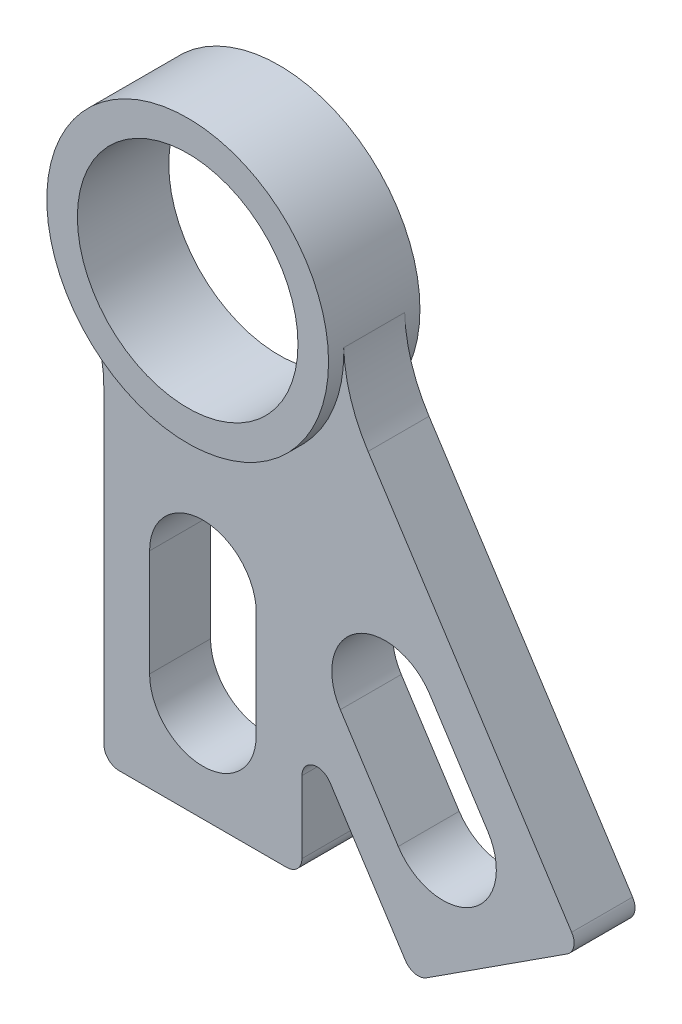
ISO-10303-21;
HEADER;
FILE_DESCRIPTION(('STEP AP214'),'2;1');
FILE_NAME('part.step','',(''),(''),'','','');
FILE_SCHEMA(('AUTOMOTIVE_DESIGN { 1 0 10303 214 1 1 1 1 }'));
ENDSEC;
DATA;
#1=APPLICATION_CONTEXT('core data for automotive mechanical design processes');
#2=APPLICATION_PROTOCOL_DEFINITION('international standard','automotive_design',2000,#1);
#3=PRODUCT_CONTEXT('',#1,'mechanical');
#4=PRODUCT('Part','Part','',(#3));
#5=PRODUCT_RELATED_PRODUCT_CATEGORY('part','',(#4));
#6=PRODUCT_DEFINITION_FORMATION('','',#4);
#7=PRODUCT_DEFINITION_CONTEXT('part definition',#1,'design');
#8=PRODUCT_DEFINITION('design','',#6,#7);
#9=PRODUCT_DEFINITION_SHAPE('','',#8);
#10=(LENGTH_UNIT() NAMED_UNIT(*) SI_UNIT(.MILLI.,.METRE.));
#11=(NAMED_UNIT(*) PLANE_ANGLE_UNIT() SI_UNIT($,.RADIAN.));
#12=(NAMED_UNIT(*) SI_UNIT($,.STERADIAN.) SOLID_ANGLE_UNIT());
#13=UNCERTAINTY_MEASURE_WITH_UNIT(LENGTH_MEASURE(1.E-05),#10,'distance_accuracy_value','');
#14=(GEOMETRIC_REPRESENTATION_CONTEXT(3) GLOBAL_UNCERTAINTY_ASSIGNED_CONTEXT((#13)) GLOBAL_UNIT_ASSIGNED_CONTEXT((#10,
#11,#12)) REPRESENTATION_CONTEXT('',''));
#15=CARTESIAN_POINT('',(0.,0.,0.));
#16=DIRECTION('',(0.,0.,1.));
#17=DIRECTION('',(1.,0.,0.));
#18=AXIS2_PLACEMENT_3D('',#15,#16,#17);
#19=CARTESIAN_POINT('',(0.,0.,4.7625));
#20=DIRECTION('',(0.,0.,-1.));
#21=DIRECTION('',(-1.,0.,0.));
#22=AXIS2_PLACEMENT_3D('',#19,#20,#21);
#23=CYLINDRICAL_SURFACE('',#22,11.495405);
#24=CARTESIAN_POINT('',(0.,0.,4.7625));
#25=DIRECTION('',(0.,0.,1.));
#26=DIRECTION('',(1.,0.,0.));
#27=AXIS2_PLACEMENT_3D('',#24,#25,#26);
#28=CIRCLE('',#27,11.495405);
#29=CARTESIAN_POINT('',(-11.495405,0.,4.7625));
#30=VERTEX_POINT('',#29);
#31=EDGE_CURVE('E380',#30,#30,#28,.T.);
#32=CARTESIAN_POINT('',(0.,0.,-4.7625));
#33=DIRECTION('',(0.,0.,1.));
#34=DIRECTION('',(1.,0.,0.));
#35=AXIS2_PLACEMENT_3D('',#32,#33,#34);
#36=CIRCLE('',#35,11.495405);
#37=CARTESIAN_POINT('',(-11.495405,0.,-4.7625));
#38=VERTEX_POINT('',#37);
#39=EDGE_CURVE('E732',#38,#38,#36,.T.);
#40=CARTESIAN_POINT('',(-11.495405,0.,4.7625));
#41=CARTESIAN_POINT('',(-11.495405,0.,4.66328125));
#42=CARTESIAN_POINT('',(-11.495405,0.,4.5640625));
#43=CARTESIAN_POINT('',(-11.495405,0.,4.365625));
#44=CARTESIAN_POINT('',(-11.495405,0.,4.26640625));
#45=CARTESIAN_POINT('',(-11.495405,0.,4.06796875));
#46=CARTESIAN_POINT('',(-11.495405,0.,3.96875));
#47=CARTESIAN_POINT('',(-11.495405,0.,3.7703125));
#48=CARTESIAN_POINT('',(-11.495405,0.,3.67109375));
#49=CARTESIAN_POINT('',(-11.495405,0.,3.47265625));
#50=CARTESIAN_POINT('',(-11.495405,0.,3.3734375));
#51=CARTESIAN_POINT('',(-11.495405,0.,3.175));
#52=CARTESIAN_POINT('',(-11.495405,0.,3.07578125));
#53=CARTESIAN_POINT('',(-11.495405,0.,2.87734375));
#54=CARTESIAN_POINT('',(-11.495405,0.,2.778125));
#55=CARTESIAN_POINT('',(-11.495405,0.,2.5796875));
#56=CARTESIAN_POINT('',(-11.495405,0.,2.48046875));
#57=CARTESIAN_POINT('',(-11.495405,0.,2.28203125));
#58=CARTESIAN_POINT('',(-11.495405,0.,2.1828125));
#59=CARTESIAN_POINT('',(-11.495405,0.,1.984375));
#60=CARTESIAN_POINT('',(-11.495405,0.,1.88515625));
#61=CARTESIAN_POINT('',(-11.495405,0.,1.68671875));
#62=CARTESIAN_POINT('',(-11.495405,0.,1.5875));
#63=CARTESIAN_POINT('',(-11.495405,0.,1.3890625));
#64=CARTESIAN_POINT('',(-11.495405,0.,1.28984375));
#65=CARTESIAN_POINT('',(-11.495405,0.,1.09140625));
#66=CARTESIAN_POINT('',(-11.495405,0.,0.992187499999999));
#67=CARTESIAN_POINT('',(-11.495405,0.,0.79375));
#68=CARTESIAN_POINT('',(-11.495405,0.,0.69453125));
#69=CARTESIAN_POINT('',(-11.495405,0.,0.49609375));
#70=CARTESIAN_POINT('',(-11.495405,0.,0.396875));
#71=CARTESIAN_POINT('',(-11.495405,0.,0.1984375));
#72=CARTESIAN_POINT('',(-11.495405,0.,0.0992187500000001));
#73=CARTESIAN_POINT('',(-11.495405,0.,-0.0992187500000001));
#74=CARTESIAN_POINT('',(-11.495405,0.,-0.1984375));
#75=CARTESIAN_POINT('',(-11.495405,0.,-0.396875));
#76=CARTESIAN_POINT('',(-11.495405,0.,-0.49609375));
#77=CARTESIAN_POINT('',(-11.495405,0.,-0.69453125));
#78=CARTESIAN_POINT('',(-11.495405,0.,-0.793750000000001));
#79=CARTESIAN_POINT('',(-11.495405,0.,-0.992187500000001));
#80=CARTESIAN_POINT('',(-11.495405,0.,-1.09140625));
#81=CARTESIAN_POINT('',(-11.495405,0.,-1.28984375));
#82=CARTESIAN_POINT('',(-11.495405,0.,-1.3890625));
#83=CARTESIAN_POINT('',(-11.495405,0.,-1.5875));
#84=CARTESIAN_POINT('',(-11.495405,0.,-1.68671875));
#85=CARTESIAN_POINT('',(-11.495405,0.,-1.88515625));
#86=CARTESIAN_POINT('',(-11.495405,0.,-1.984375));
#87=CARTESIAN_POINT('',(-11.495405,0.,-2.1828125));
#88=CARTESIAN_POINT('',(-11.495405,0.,-2.28203125));
#89=CARTESIAN_POINT('',(-11.495405,0.,-2.48046875));
#90=CARTESIAN_POINT('',(-11.495405,0.,-2.5796875));
#91=CARTESIAN_POINT('',(-11.495405,0.,-2.778125));
#92=CARTESIAN_POINT('',(-11.495405,0.,-2.87734375));
#93=CARTESIAN_POINT('',(-11.495405,0.,-3.07578125));
#94=CARTESIAN_POINT('',(-11.495405,0.,-3.175));
#95=CARTESIAN_POINT('',(-11.495405,0.,-3.3734375));
#96=CARTESIAN_POINT('',(-11.495405,0.,-3.47265625));
#97=CARTESIAN_POINT('',(-11.495405,0.,-3.67109375));
#98=CARTESIAN_POINT('',(-11.495405,0.,-3.7703125));
#99=CARTESIAN_POINT('',(-11.495405,0.,-3.96875));
#100=CARTESIAN_POINT('',(-11.495405,0.,-4.06796875));
#101=CARTESIAN_POINT('',(-11.495405,0.,-4.26640625));
#102=CARTESIAN_POINT('',(-11.495405,0.,-4.365625));
#103=CARTESIAN_POINT('',(-11.495405,0.,-4.5640625));
#104=CARTESIAN_POINT('',(-11.495405,0.,-4.66328125));
#105=CARTESIAN_POINT('',(-11.495405,0.,-4.7625));
#106=B_SPLINE_CURVE_WITH_KNOTS('',3,(#40,#41,#42,#43,#44,#45,#46,#47,#48,#49,#50,#51,#52,#53,
#54,#55,#56,#57,#58,#59,#60,#61,#62,#63,#64,#65,#66,#67,#68,#69,#70,#71,#72,#73,#74,#75,#76,#77,
#78,#79,#80,#81,#82,#83,#84,#85,#86,#87,#88,#89,#90,#91,#92,#93,#94,#95,#96,#97,#98,#99,#100,
#101,#102,#103,#104,#105),.UNSPECIFIED.,.F.,.F.,(4,2,2,2,2,2,2,2,2,2,2,2,2,2,2,2,2,2,2,2,2,2,2,
2,2,2,2,2,2,2,2,2,4),(0.,0.29765625,0.5953125,0.892968750000001,1.190625,1.48828125,1.7859375,
2.08359375,2.38125,2.67890625,2.9765625,3.27421875,3.571875,3.86953125,4.1671875,4.46484375,
4.7625,5.06015625,5.3578125,5.65546875,5.953125,6.25078125,6.5484375,6.84609375,7.14375,
7.44140625,7.7390625,8.03671875,8.334375,8.63203125,8.9296875,9.22734375,9.525),.UNSPECIFIED.);
#107=EDGE_CURVE('BSEAM39',#30,#38,#106,.T.);
#108=ORIENTED_EDGE('',*,*,#31,.T.);
#109=ORIENTED_EDGE('',*,*,#39,.F.);
#110=ORIENTED_EDGE('',*,*,#107,.T.);
#111=ORIENTED_EDGE('',*,*,#107,.F.);
#112=EDGE_LOOP('',(#108,#110,#109,#111));
#113=FACE_BOUND('',#112,.T.);
#114=ADVANCED_FACE('F39',(#113),#23,.F.);
#115=CARTESIAN_POINT('',(0.,0.,4.7625));
#116=DIRECTION('',(0.,0.,-1.));
#117=DIRECTION('',(-1.,0.,0.));
#118=AXIS2_PLACEMENT_3D('',#115,#116,#117);
#119=CYLINDRICAL_SURFACE('',#118,14.6812);
#120=DIRECTION('',(0.,0.,-1.));
#121=VECTOR('',#120,1.);
#122=CARTESIAN_POINT('',(-12.585193266832,-7.55979787272684,3.175));
#123=LINE('',#122,#121);
#124=CARTESIAN_POINT('',(-12.585193266832,-7.55979787272684,3.175));
#125=VERTEX_POINT('',#124);
#126=CARTESIAN_POINT('',(-12.585193266832,-7.55979787272684,-3.175));
#127=VERTEX_POINT('',#126);
#128=EDGE_CURVE('E200',#125,#127,#123,.T.);
#129=ORIENTED_EDGE('',*,*,#128,.F.);
#130=CARTESIAN_POINT('',(0.,0.,3.175));
#131=DIRECTION('',(0.,0.,1.));
#132=DIRECTION('',(1.,0.,0.));
#133=AXIS2_PLACEMENT_3D('',#130,#131,#132);
#134=CIRCLE('',#133,14.6812);
#135=CARTESIAN_POINT('',(14.6729838648991,0.491098707398738,3.175));
#136=VERTEX_POINT('',#135);
#137=EDGE_CURVE('E216',#125,#136,#134,.T.);
#138=ORIENTED_EDGE('',*,*,#137,.T.);
#139=DIRECTION('',(0.,0.,-1.));
#140=VECTOR('',#139,1.);
#141=CARTESIAN_POINT('',(14.6729838648992,0.491098707398739,3.175));
#142=LINE('',#141,#140);
#143=CARTESIAN_POINT('',(14.6729838648992,0.491098707398739,-3.175));
#144=VERTEX_POINT('',#143);
#145=EDGE_CURVE('E299',#136,#144,#142,.T.);
#146=ORIENTED_EDGE('',*,*,#145,.T.);
#147=CARTESIAN_POINT('',(0.,0.,-3.175));
#148=DIRECTION('',(0.,0.,1.));
#149=DIRECTION('',(1.,0.,0.));
#150=AXIS2_PLACEMENT_3D('',#147,#148,#149);
#151=CIRCLE('',#150,14.6812);
#152=EDGE_CURVE('E300',#127,#144,#151,.T.);
#153=ORIENTED_EDGE('',*,*,#152,.F.);
#154=EDGE_LOOP('',(#129,#138,#146,#153));
#155=FACE_BOUND('',#154,.T.);
#156=CARTESIAN_POINT('',(0.,0.,4.7625));
#157=DIRECTION('',(0.,0.,1.));
#158=DIRECTION('',(1.,0.,0.));
#159=AXIS2_PLACEMENT_3D('',#156,#157,#158);
#160=CIRCLE('',#159,14.6812);
#161=CARTESIAN_POINT('',(14.6812,0.,4.7625));
#162=VERTEX_POINT('',#161);
#163=EDGE_CURVE('E437',#162,#162,#160,.T.);
#164=ORIENTED_EDGE('',*,*,#163,.F.);
#165=EDGE_LOOP('',(#164));
#166=FACE_BOUND('',#165,.T.);
#167=CARTESIAN_POINT('',(0.,0.,-4.7625));
#168=DIRECTION('',(0.,0.,1.));
#169=DIRECTION('',(1.,0.,0.));
#170=AXIS2_PLACEMENT_3D('',#167,#168,#169);
#171=CIRCLE('',#170,14.6812);
#172=CARTESIAN_POINT('',(14.6812,0.,-4.7625));
#173=VERTEX_POINT('',#172);
#174=EDGE_CURVE('E442',#173,#173,#171,.T.);
#175=ORIENTED_EDGE('',*,*,#174,.T.);
#176=EDGE_LOOP('',(#175));
#177=FACE_BOUND('',#176,.T.);
#178=ADVANCED_FACE('F470',(#155,#166,#177),#119,.T.);
#179=CARTESIAN_POINT('',(0.,0.,4.7625));
#180=DIRECTION('',(0.,0.,1.));
#181=DIRECTION('',(1.,0.,0.));
#182=AXIS2_PLACEMENT_3D('',#179,#180,#181);
#183=PLANE('',#182);
#184=ORIENTED_EDGE('',*,*,#31,.F.);
#185=EDGE_LOOP('',(#184));
#186=FACE_BOUND('',#185,.T.);
#187=ORIENTED_EDGE('',*,*,#163,.T.);
#188=EDGE_LOOP('',(#187));
#189=FACE_BOUND('',#188,.T.);
#190=ADVANCED_FACE('F497',(#186,#189),#183,.T.);
#191=CARTESIAN_POINT('',(0.,0.,-4.7625));
#192=DIRECTION('',(0.,0.,1.));
#193=DIRECTION('',(1.,0.,0.));
#194=AXIS2_PLACEMENT_3D('',#191,#192,#193);
#195=PLANE('',#194);
#196=ORIENTED_EDGE('',*,*,#39,.T.);
#197=EDGE_LOOP('',(#196));
#198=FACE_BOUND('',#197,.T.);
#199=ORIENTED_EDGE('',*,*,#174,.F.);
#200=EDGE_LOOP('',(#199));
#201=FACE_BOUND('',#200,.T.);
#202=ADVANCED_FACE('F690',(#198,#201),#195,.F.);
#203=CARTESIAN_POINT('',(0.,-27.9580697939255,3.175));
#204=DIRECTION('',(0.,0.,-1.));
#205=DIRECTION('',(-1.,0.,0.));
#206=AXIS2_PLACEMENT_3D('',#203,#204,#205);
#207=CYLINDRICAL_SURFACE('',#206,5.55624999999843);
#208=CARTESIAN_POINT('',(0.,-27.9580697939255,-3.175));
#209=DIRECTION('',(0.,0.,1.));
#210=DIRECTION('',(1.,0.,0.));
#211=AXIS2_PLACEMENT_3D('',#208,#209,#210);
#212=CIRCLE('',#211,5.55624999999843);
#213=CARTESIAN_POINT('',(5.55624999999843,-27.9580697939256,-3.175));
#214=VERTEX_POINT('',#213);
#215=CARTESIAN_POINT('',(-5.55624999999843,-27.9580697939256,-3.175));
#216=VERTEX_POINT('',#215);
#217=EDGE_CURVE('E340',#214,#216,#212,.T.);
#218=ORIENTED_EDGE('',*,*,#217,.F.);
#219=DIRECTION('',(0.,0.,-1.));
#220=VECTOR('',#219,1.);
#221=CARTESIAN_POINT('',(5.55624999999843,-27.9580697939256,3.175));
#222=LINE('',#221,#220);
#223=CARTESIAN_POINT('',(5.55624999999843,-27.9580697939256,3.175));
#224=VERTEX_POINT('',#223);
#225=EDGE_CURVE('E734',#224,#214,#222,.T.);
#226=ORIENTED_EDGE('',*,*,#225,.F.);
#227=CARTESIAN_POINT('',(0.,-27.9580697939255,3.175));
#228=DIRECTION('',(0.,0.,1.));
#229=DIRECTION('',(1.,0.,0.));
#230=AXIS2_PLACEMENT_3D('',#227,#228,#229);
#231=CIRCLE('',#230,5.55624999999843);
#232=CARTESIAN_POINT('',(-5.55624999999843,-27.9580697939256,3.175));
#233=VERTEX_POINT('',#232);
#234=EDGE_CURVE('E280',#224,#233,#231,.T.);
#235=ORIENTED_EDGE('',*,*,#234,.T.);
#236=DIRECTION('',(0.,0.,-1.));
#237=VECTOR('',#236,1.);
#238=CARTESIAN_POINT('',(-5.55624999999843,-27.9580697939256,3.175));
#239=LINE('',#238,#237);
#240=EDGE_CURVE('E359',#233,#216,#239,.T.);
#241=ORIENTED_EDGE('',*,*,#240,.T.);
#242=EDGE_LOOP('',(#218,#226,#235,#241));
#243=FACE_BOUND('',#242,.T.);
#244=ADVANCED_FACE('F680',(#243),#207,.F.);
#245=CARTESIAN_POINT('',(5.55624999999831,0.,3.175));
#246=DIRECTION('',(-1.,0.,0.));
#247=DIRECTION('',(0.,-1.,0.));
#248=AXIS2_PLACEMENT_3D('',#245,#246,#247);
#249=PLANE('',#248);
#250=DIRECTION('',(0.,1.,0.));
#251=VECTOR('',#250,1.);
#252=CARTESIAN_POINT('',(5.55624999999831,0.,-3.175));
#253=LINE('',#252,#251);
#254=CARTESIAN_POINT('',(5.55624999999848,-39.0705697939288,-3.175));
#255=VERTEX_POINT('',#254);
#256=EDGE_CURVE('E346',#255,#214,#253,.T.);
#257=ORIENTED_EDGE('',*,*,#256,.F.);
#258=DIRECTION('',(0.,0.,-1.));
#259=VECTOR('',#258,1.);
#260=CARTESIAN_POINT('',(5.55624999999848,-39.0705697939288,3.175));
#261=LINE('',#260,#259);
#262=CARTESIAN_POINT('',(5.55624999999848,-39.0705697939288,3.175));
#263=VERTEX_POINT('',#262);
#264=EDGE_CURVE('E736',#263,#255,#261,.T.);
#265=ORIENTED_EDGE('',*,*,#264,.F.);
#266=DIRECTION('',(0.,1.,0.));
#267=VECTOR('',#266,1.);
#268=CARTESIAN_POINT('',(5.55624999999831,0.,3.175));
#269=LINE('',#268,#267);
#270=EDGE_CURVE('E284',#263,#224,#269,.T.);
#271=ORIENTED_EDGE('',*,*,#270,.T.);
#272=ORIENTED_EDGE('',*,*,#225,.T.);
#273=EDGE_LOOP('',(#257,#265,#271,#272));
#274=FACE_BOUND('',#273,.T.);
#275=ADVANCED_FACE('F670',(#274),#249,.T.);
#276=CARTESIAN_POINT('',(0.,-39.0705697939288,3.175));
#277=DIRECTION('',(0.,0.,-1.));
#278=DIRECTION('',(-1.,0.,0.));
#279=AXIS2_PLACEMENT_3D('',#276,#277,#278);
#280=CYLINDRICAL_SURFACE('',#279,5.55624999999845);
#281=CARTESIAN_POINT('',(0.,-39.0705697939288,-3.175));
#282=DIRECTION('',(0.,0.,1.));
#283=DIRECTION('',(1.,0.,0.));
#284=AXIS2_PLACEMENT_3D('',#281,#282,#283);
#285=CIRCLE('',#284,5.55624999999845);
#286=CARTESIAN_POINT('',(-5.55624999999842,-39.0705697939288,-3.175));
#287=VERTEX_POINT('',#286);
#288=EDGE_CURVE('E357',#287,#255,#285,.T.);
#289=ORIENTED_EDGE('',*,*,#288,.F.);
#290=DIRECTION('',(0.,0.,-1.));
#291=VECTOR('',#290,1.);
#292=CARTESIAN_POINT('',(-5.55624999999842,-39.0705697939288,3.175));
#293=LINE('',#292,#291);
#294=CARTESIAN_POINT('',(-5.55624999999842,-39.0705697939288,3.175));
#295=VERTEX_POINT('',#294);
#296=EDGE_CURVE('E362',#295,#287,#293,.T.);
#297=ORIENTED_EDGE('',*,*,#296,.F.);
#298=CARTESIAN_POINT('',(0.,-39.0705697939288,3.175));
#299=DIRECTION('',(0.,0.,1.));
#300=DIRECTION('',(1.,0.,0.));
#301=AXIS2_PLACEMENT_3D('',#298,#299,#300);
#302=CIRCLE('',#301,5.55624999999845);
#303=EDGE_CURVE('E288',#295,#263,#302,.T.);
#304=ORIENTED_EDGE('',*,*,#303,.T.);
#305=ORIENTED_EDGE('',*,*,#264,.T.);
#306=EDGE_LOOP('',(#289,#297,#304,#305));
#307=FACE_BOUND('',#306,.T.);
#308=ADVANCED_FACE('F660',(#307),#280,.F.);
#309=CARTESIAN_POINT('',(18.9851807063122,-29.335661577197,3.175));
#310=DIRECTION('',(0.,0.,-1.));
#311=DIRECTION('',(-1.,0.,0.));
#312=AXIS2_PLACEMENT_3D('',#309,#310,#311);
#313=CYLINDRICAL_SURFACE('',#312,5.55624999999836);
#314=CARTESIAN_POINT('',(18.9851807063122,-29.335661577197,-3.175));
#315=DIRECTION('',(0.,0.,1.));
#316=DIRECTION('',(1.,0.,0.));
#317=AXIS2_PLACEMENT_3D('',#314,#315,#316);
#318=CIRCLE('',#317,5.55624999999836);
#319=CARTESIAN_POINT('',(23.649804352704,-26.3168538158441,-3.175));
#320=VERTEX_POINT('',#319);
#321=CARTESIAN_POINT('',(14.3205570599207,-32.3544693385504,-3.175));
#322=VERTEX_POINT('',#321);
#323=EDGE_CURVE('E323',#320,#322,#318,.T.);
#324=ORIENTED_EDGE('',*,*,#323,.F.);
#325=DIRECTION('',(0.,0.,-1.));
#326=VECTOR('',#325,1.);
#327=CARTESIAN_POINT('',(23.649804352704,-26.3168538158441,3.175));
#328=LINE('',#327,#326);
#329=CARTESIAN_POINT('',(23.649804352704,-26.3168538158441,3.175));
#330=VERTEX_POINT('',#329);
#331=EDGE_CURVE('E363',#330,#320,#328,.T.);
#332=ORIENTED_EDGE('',*,*,#331,.F.);
#333=CARTESIAN_POINT('',(18.9851807063122,-29.335661577197,3.175));
#334=DIRECTION('',(0.,0.,1.));
#335=DIRECTION('',(1.,0.,0.));
#336=AXIS2_PLACEMENT_3D('',#333,#334,#335);
#337=CIRCLE('',#336,5.55624999999836);
#338=CARTESIAN_POINT('',(14.3205570599207,-32.3544693385504,3.175));
#339=VERTEX_POINT('',#338);
#340=EDGE_CURVE('E262',#330,#339,#337,.T.);
#341=ORIENTED_EDGE('',*,*,#340,.T.);
#342=DIRECTION('',(0.,0.,-1.));
#343=VECTOR('',#342,1.);
#344=CARTESIAN_POINT('',(14.3205570599207,-32.3544693385504,3.175));
#345=LINE('',#344,#343);
#346=EDGE_CURVE('E379',#339,#322,#345,.T.);
#347=ORIENTED_EDGE('',*,*,#346,.T.);
#348=EDGE_LOOP('',(#324,#332,#341,#347));
#349=FACE_BOUND('',#348,.T.);
#350=ADVANCED_FACE('F650',(#349),#313,.F.);
#351=CARTESIAN_POINT('',(4.6646236463908,3.0188077613531,3.175));
#352=DIRECTION('',(-0.839527315436269,-0.543317482358493,0.));
#353=DIRECTION('',(0.543317482358493,-0.839527315436269,0.));
#354=AXIS2_PLACEMENT_3D('',#351,#352,#353);
#355=PLANE('',#354);
#356=DIRECTION('',(-0.543317482358493,0.839527315436269,0.));
#357=VECTOR('',#356,1.);
#358=CARTESIAN_POINT('',(4.6646236463908,3.0188077613531,-3.175));
#359=LINE('',#358,#357);
#360=CARTESIAN_POINT('',(29.6874198754141,-35.6461011086318,-3.175));
#361=VERTEX_POINT('',#360);
#362=EDGE_CURVE('E327',#361,#320,#359,.T.);
#363=ORIENTED_EDGE('',*,*,#362,.F.);
#364=DIRECTION('',(0.,0.,-1.));
#365=VECTOR('',#364,1.);
#366=CARTESIAN_POINT('',(29.6874198754141,-35.6461011086318,3.175));
#367=LINE('',#366,#365);
#368=CARTESIAN_POINT('',(29.6874198754141,-35.6461011086318,3.175));
#369=VERTEX_POINT('',#368);
#370=EDGE_CURVE('E745',#369,#361,#367,.T.);
#371=ORIENTED_EDGE('',*,*,#370,.F.);
#372=DIRECTION('',(-0.543317482358493,0.839527315436269,0.));
#373=VECTOR('',#372,1.);
#374=CARTESIAN_POINT('',(4.6646236463908,3.0188077613531,3.175));
#375=LINE('',#374,#373);
#376=EDGE_CURVE('E266',#369,#330,#375,.T.);
#377=ORIENTED_EDGE('',*,*,#376,.T.);
#378=ORIENTED_EDGE('',*,*,#331,.T.);
#379=EDGE_LOOP('',(#363,#371,#377,#378));
#380=FACE_BOUND('',#379,.T.);
#381=ADVANCED_FACE('F640',(#380),#355,.T.);
#382=CARTESIAN_POINT('',(25.0227962290226,-38.6649088699853,3.175));
#383=DIRECTION('',(0.,0.,-1.));
#384=DIRECTION('',(-1.,0.,0.));
#385=AXIS2_PLACEMENT_3D('',#382,#383,#384);
#386=CYLINDRICAL_SURFACE('',#385,5.55624999999846);
#387=CARTESIAN_POINT('',(25.0227962290226,-38.6649088699853,-3.175));
#388=DIRECTION('',(0.,0.,1.));
#389=DIRECTION('',(1.,0.,0.));
#390=AXIS2_PLACEMENT_3D('',#387,#388,#389);
#391=CIRCLE('',#390,5.55624999999846);
#392=CARTESIAN_POINT('',(20.3581725826311,-41.6837166313387,-3.175));
#393=VERTEX_POINT('',#392);
#394=EDGE_CURVE('E341',#393,#361,#391,.T.);
#395=ORIENTED_EDGE('',*,*,#394,.F.);
#396=DIRECTION('',(0.,0.,-1.));
#397=VECTOR('',#396,1.);
#398=CARTESIAN_POINT('',(20.3581725826311,-41.6837166313387,3.175));
#399=LINE('',#398,#397);
#400=CARTESIAN_POINT('',(20.3581725826311,-41.6837166313387,3.175));
#401=VERTEX_POINT('',#400);
#402=EDGE_CURVE('E743',#401,#393,#399,.T.);
#403=ORIENTED_EDGE('',*,*,#402,.F.);
#404=CARTESIAN_POINT('',(25.0227962290226,-38.6649088699853,3.175));
#405=DIRECTION('',(0.,0.,1.));
#406=DIRECTION('',(1.,0.,0.));
#407=AXIS2_PLACEMENT_3D('',#404,#405,#406);
#408=CIRCLE('',#407,5.55624999999846);
#409=EDGE_CURVE('E270',#401,#369,#408,.T.);
#410=ORIENTED_EDGE('',*,*,#409,.T.);
#411=ORIENTED_EDGE('',*,*,#370,.T.);
#412=EDGE_LOOP('',(#395,#403,#410,#411));
#413=FACE_BOUND('',#412,.T.);
#414=ADVANCED_FACE('F631',(#413),#386,.F.);
#415=CARTESIAN_POINT('',(-26.1937499999968,-15.7343197939272,3.175));
#416=DIRECTION('',(0.,0.,-1.));
#417=DIRECTION('',(-1.,0.,0.));
#418=AXIS2_PLACEMENT_3D('',#415,#416,#417);
#419=CYLINDRICAL_SURFACE('',#418,15.8749999999984);
#420=CARTESIAN_POINT('',(-26.1937499999968,-15.7343197939272,-3.175));
#421=DIRECTION('',(0.,0.,1.));
#422=DIRECTION('',(1.,0.,0.));
#423=AXIS2_PLACEMENT_3D('',#420,#421,#422);
#424=CIRCLE('',#423,15.8749999999984);
#425=CARTESIAN_POINT('',(-10.3187499999984,-15.7343197939272,-3.175));
#426=VERTEX_POINT('',#425);
#427=EDGE_CURVE('E196',#426,#127,#424,.T.);
#428=ORIENTED_EDGE('',*,*,#427,.F.);
#429=DIRECTION('',(0.,0.,-1.));
#430=VECTOR('',#429,1.);
#431=CARTESIAN_POINT('',(-10.3187499999984,-15.7343197939272,3.175));
#432=LINE('',#431,#430);
#433=CARTESIAN_POINT('',(-10.3187499999984,-15.7343197939272,3.175));
#434=VERTEX_POINT('',#433);
#435=EDGE_CURVE('E189',#434,#426,#432,.T.);
#436=ORIENTED_EDGE('',*,*,#435,.F.);
#437=CARTESIAN_POINT('',(-26.1937499999968,-15.7343197939272,3.175));
#438=DIRECTION('',(0.,0.,1.));
#439=DIRECTION('',(1.,0.,0.));
#440=AXIS2_PLACEMENT_3D('',#437,#438,#439);
#441=CIRCLE('',#440,15.8749999999984);
#442=EDGE_CURVE('E194',#434,#125,#441,.T.);
#443=ORIENTED_EDGE('',*,*,#442,.T.);
#444=ORIENTED_EDGE('',*,*,#128,.T.);
#445=EDGE_LOOP('',(#428,#436,#443,#444));
#446=FACE_BOUND('',#445,.T.);
#447=ADVANCED_FACE('F191',(#446),#419,.F.);
#448=CARTESIAN_POINT('',(-10.3187499999984,0.,3.175));
#449=DIRECTION('',(1.,0.,0.));
#450=DIRECTION('',(0.,1.,0.));
#451=AXIS2_PLACEMENT_3D('',#448,#449,#450);
#452=PLANE('',#451);
#453=DIRECTION('',(0.,-1.,0.));
#454=VECTOR('',#453,1.);
#455=CARTESIAN_POINT('',(-10.3187499999984,0.,-3.175));
#456=LINE('',#455,#454);
#457=CARTESIAN_POINT('',(-10.3187499999984,-47.8018197939272,-3.175));
#458=VERTEX_POINT('',#457);
#459=EDGE_CURVE('E465',#426,#458,#456,.T.);
#460=ORIENTED_EDGE('',*,*,#459,.T.);
#461=DIRECTION('',(0.,0.,-1.));
#462=VECTOR('',#461,1.);
#463=CARTESIAN_POINT('',(-10.3187499999984,-47.8018197939272,3.175));
#464=LINE('',#463,#462);
#465=CARTESIAN_POINT('',(-10.3187499999984,-47.8018197939272,3.175));
#466=VERTEX_POINT('',#465);
#467=EDGE_CURVE('E207',#458,#466,#464,.F.);
#468=ORIENTED_EDGE('',*,*,#467,.T.);
#469=DIRECTION('',(0.,-1.,0.));
#470=VECTOR('',#469,1.);
#471=CARTESIAN_POINT('',(-10.3187499999984,0.,3.175));
#472=LINE('',#471,#470);
#473=EDGE_CURVE('E204',#434,#466,#472,.T.);
#474=ORIENTED_EDGE('',*,*,#473,.F.);
#475=ORIENTED_EDGE('',*,*,#435,.T.);
#476=EDGE_LOOP('',(#460,#468,#474,#475));
#477=FACE_BOUND('',#476,.T.);
#478=ADVANCED_FACE('F205',(#477),#452,.F.);
#479=CARTESIAN_POINT('',(0.,-49.3893197939272,3.175));
#480=DIRECTION('',(0.,1.,0.));
#481=DIRECTION('',(-1.,0.,0.));
#482=AXIS2_PLACEMENT_3D('',#479,#480,#481);
#483=PLANE('',#482);
#484=DIRECTION('',(1.,0.,0.));
#485=VECTOR('',#484,1.);
#486=CARTESIAN_POINT('',(0.,-49.3893197939272,-3.175));
#487=LINE('',#486,#485);
#488=CARTESIAN_POINT('',(-8.73124999999842,-49.3893197939272,-3.175));
#489=VERTEX_POINT('',#488);
#490=CARTESIAN_POINT('',(8.73124999999837,-49.3893197939272,-3.175));
#491=VERTEX_POINT('',#490);
#492=EDGE_CURVE('E396',#489,#491,#487,.T.);
#493=ORIENTED_EDGE('',*,*,#492,.T.);
#494=DIRECTION('',(0.,0.,-1.));
#495=VECTOR('',#494,1.);
#496=CARTESIAN_POINT('',(8.73124999999837,-49.3893197939272,3.175));
#497=LINE('',#496,#495);
#498=CARTESIAN_POINT('',(8.73124999999837,-49.3893197939272,3.175));
#499=VERTEX_POINT('',#498);
#500=EDGE_CURVE('E453',#491,#499,#497,.F.);
#501=ORIENTED_EDGE('',*,*,#500,.T.);
#502=DIRECTION('',(1.,0.,0.));
#503=VECTOR('',#502,1.);
#504=CARTESIAN_POINT('',(0.,-49.3893197939272,3.175));
#505=LINE('',#504,#503);
#506=CARTESIAN_POINT('',(-8.73124999999842,-49.3893197939272,3.175));
#507=VERTEX_POINT('',#506);
#508=EDGE_CURVE('E209',#507,#499,#505,.T.);
#509=ORIENTED_EDGE('',*,*,#508,.F.);
#510=DIRECTION('',(0.,0.,-1.));
#511=VECTOR('',#510,1.);
#512=CARTESIAN_POINT('',(-8.73124999999842,-49.3893197939272,3.175));
#513=LINE('',#512,#511);
#514=EDGE_CURVE('E451',#507,#489,#513,.T.);
#515=ORIENTED_EDGE('',*,*,#514,.T.);
#516=EDGE_LOOP('',(#493,#501,#509,#515));
#517=FACE_BOUND('',#516,.T.);
#518=ADVANCED_FACE('F458',(#517),#483,.F.);
#519=CARTESIAN_POINT('',(10.3187499999986,0.,3.175));
#520=DIRECTION('',(1.,0.,0.));
#521=DIRECTION('',(0.,1.,0.));
#522=AXIS2_PLACEMENT_3D('',#519,#520,#521);
#523=PLANE('',#522);
#524=DIRECTION('',(0.,-1.,0.));
#525=VECTOR('',#524,1.);
#526=CARTESIAN_POINT('',(10.3187499999986,0.,3.175));
#527=LINE('',#526,#525);
#528=CARTESIAN_POINT('',(10.3187499999984,-40.3113700747062,3.175));
#529=VERTEX_POINT('',#528);
#530=CARTESIAN_POINT('',(10.3187499999984,-47.8018197939272,3.175));
#531=VERTEX_POINT('',#530);
#532=EDGE_CURVE('E463',#529,#531,#527,.T.);
#533=ORIENTED_EDGE('',*,*,#532,.T.);
#534=DIRECTION('',(0.,0.,-1.));
#535=VECTOR('',#534,1.);
#536=CARTESIAN_POINT('',(10.3187499999984,-47.8018197939272,-3.175));
#537=LINE('',#536,#535);
#538=CARTESIAN_POINT('',(10.3187499999984,-47.8018197939272,-3.175));
#539=VERTEX_POINT('',#538);
#540=EDGE_CURVE('E434',#531,#539,#537,.T.);
#541=ORIENTED_EDGE('',*,*,#540,.T.);
#542=DIRECTION('',(0.,-1.,0.));
#543=VECTOR('',#542,1.);
#544=CARTESIAN_POINT('',(10.3187499999986,0.,-3.175));
#545=LINE('',#544,#543);
#546=CARTESIAN_POINT('',(10.3187499999984,-40.3113700747062,-3.175));
#547=VERTEX_POINT('',#546);
#548=EDGE_CURVE('E392',#547,#539,#545,.T.);
#549=ORIENTED_EDGE('',*,*,#548,.F.);
#550=DIRECTION('',(0.,0.,-1.));
#551=VECTOR('',#550,1.);
#552=CARTESIAN_POINT('',(10.3187499999984,-40.3113700747062,3.175));
#553=LINE('',#552,#551);
#554=EDGE_CURVE('E431',#547,#529,#553,.F.);
#555=ORIENTED_EDGE('',*,*,#554,.T.);
#556=EDGE_LOOP('',(#533,#541,#549,#555));
#557=FACE_BOUND('',#556,.T.);
#558=ADVANCED_FACE('F430',(#557),#523,.T.);
#559=CARTESIAN_POINT('',(-8.66287248615676,-5.60635727108567,3.175));
#560=DIRECTION('',(-0.839527315436279,-0.543317482358477,0.));
#561=DIRECTION('',(0.543317482358477,-0.839527315436279,0.));
#562=AXIS2_PLACEMENT_3D('',#559,#560,#561);
#563=PLANE('',#562);
#564=DIRECTION('',(-0.543317482358477,0.839527315436279,0.));
#565=VECTOR('',#564,1.);
#566=CARTESIAN_POINT('',(-8.66287248615676,-5.60635727108567,-3.175));
#567=LINE('',#566,#565);
#568=CARTESIAN_POINT('',(21.1037645107074,-51.6013890139727,-3.175));
#569=VERTEX_POINT('',#568);
#570=CARTESIAN_POINT('',(13.2389996132535,-39.4488535714622,-3.175));
#571=VERTEX_POINT('',#570);
#572=EDGE_CURVE('E395',#569,#571,#567,.T.);
#573=ORIENTED_EDGE('',*,*,#572,.F.);
#574=DIRECTION('',(0.,0.,-1.));
#575=VECTOR('',#574,1.);
#576=CARTESIAN_POINT('',(21.1037645107074,-51.6013890139726,3.175));
#577=LINE('',#576,#575);
#578=CARTESIAN_POINT('',(21.1037645107074,-51.6013890139727,3.175));
#579=VERTEX_POINT('',#578);
#580=EDGE_CURVE('E416',#569,#579,#577,.F.);
#581=ORIENTED_EDGE('',*,*,#580,.T.);
#582=DIRECTION('',(-0.543317482358477,0.839527315436279,0.));
#583=VECTOR('',#582,1.);
#584=CARTESIAN_POINT('',(-8.66287248615676,-5.60635727108567,3.175));
#585=LINE('',#584,#583);
#586=CARTESIAN_POINT('',(13.2389996132535,-39.4488535714622,3.175));
#587=VERTEX_POINT('',#586);
#588=EDGE_CURVE('E256',#579,#587,#585,.T.);
#589=ORIENTED_EDGE('',*,*,#588,.T.);
#590=DIRECTION('',(0.,0.,-1.));
#591=VECTOR('',#590,1.);
#592=CARTESIAN_POINT('',(13.2389996132535,-39.4488535714622,-3.175));
#593=LINE('',#592,#591);
#594=EDGE_CURVE('E411',#587,#571,#593,.T.);
#595=ORIENTED_EDGE('',*,*,#594,.T.);
#596=EDGE_LOOP('',(#573,#581,#589,#595));
#597=FACE_BOUND('',#596,.T.);
#598=ADVANCED_FACE('F488',(#597),#563,.T.);
#599=CARTESIAN_POINT('',(30.6291535001082,-47.3277813561421,3.175));
#600=DIRECTION('',(-0.543317482358477,0.839527315436279,0.));
#601=DIRECTION('',(-0.839527315436279,-0.543317482358477,0.));
#602=AXIS2_PLACEMENT_3D('',#599,#600,#601);
#603=PLANE('',#602);
#604=DIRECTION('',(0.839527315436279,0.543317482358477,0.));
#605=VECTOR('',#604,1.);
#606=CARTESIAN_POINT('',(30.6291535001082,-47.3277813561421,3.175));
#607=LINE('',#606,#605);
#608=CARTESIAN_POINT('',(23.2990306272066,-52.0716221239837,3.175));
#609=VERTEX_POINT('',#608);
#610=CARTESIAN_POINT('',(37.9592763730099,-42.5839405883005,3.175));
#611=VERTEX_POINT('',#610);
#612=EDGE_CURVE('E252',#609,#611,#607,.T.);
#613=ORIENTED_EDGE('',*,*,#612,.F.);
#614=DIRECTION('',(0.,0.,-1.));
#615=VECTOR('',#614,1.);
#616=CARTESIAN_POINT('',(23.2990306272066,-52.0716221239837,-3.175));
#617=LINE('',#616,#615);
#618=CARTESIAN_POINT('',(23.2990306272066,-52.0716221239837,-3.175));
#619=VERTEX_POINT('',#618);
#620=EDGE_CURVE('E406',#609,#619,#617,.T.);
#621=ORIENTED_EDGE('',*,*,#620,.T.);
#622=DIRECTION('',(0.839527315436279,0.543317482358477,0.));
#623=VECTOR('',#622,1.);
#624=CARTESIAN_POINT('',(30.6291535001082,-47.3277813561421,-3.175));
#625=LINE('',#624,#623);
#626=CARTESIAN_POINT('',(37.9592763730099,-42.5839405883005,-3.175));
#627=VERTEX_POINT('',#626);
#628=EDGE_CURVE('E318',#619,#627,#625,.T.);
#629=ORIENTED_EDGE('',*,*,#628,.T.);
#630=DIRECTION('',(0.,0.,-1.));
#631=VECTOR('',#630,1.);
#632=CARTESIAN_POINT('',(37.9592763730099,-42.5839405883005,3.175));
#633=LINE('',#632,#631);
#634=EDGE_CURVE('E62',#627,#611,#633,.F.);
#635=ORIENTED_EDGE('',*,*,#634,.T.);
#636=EDGE_LOOP('',(#613,#621,#629,#635));
#637=FACE_BOUND('',#636,.T.);
#638=ADVANCED_FACE('F404',(#637),#603,.F.);
#639=CARTESIAN_POINT('',(8.66287248615665,5.60635727108562,3.175));
#640=DIRECTION('',(-0.839527315436278,-0.543317482358479,0.));
#641=DIRECTION('',(0.543317482358479,-0.839527315436278,0.));
#642=AXIS2_PLACEMENT_3D('',#639,#640,#641);
#643=PLANE('',#642);
#644=DIRECTION('',(-0.543317482358479,0.839527315436278,0.));
#645=VECTOR('',#644,1.);
#646=CARTESIAN_POINT('',(8.66287248615665,5.60635727108562,3.175));
#647=LINE('',#646,#645);
#648=CARTESIAN_POINT('',(38.4295094830209,-40.3886744718013,3.175));
#649=VERTEX_POINT('',#648);
#650=CARTESIAN_POINT('',(17.2116035032156,-7.6030339857248,3.175));
#651=VERTEX_POINT('',#650);
#652=EDGE_CURVE('E255',#649,#651,#647,.T.);
#653=ORIENTED_EDGE('',*,*,#652,.F.);
#654=DIRECTION('',(0.,0.,-1.));
#655=VECTOR('',#654,1.);
#656=CARTESIAN_POINT('',(38.4295094830209,-40.3886744718013,3.175));
#657=LINE('',#656,#655);
#658=CARTESIAN_POINT('',(38.4295094830209,-40.3886744718013,-3.175));
#659=VERTEX_POINT('',#658);
#660=EDGE_CURVE('E419',#649,#659,#657,.T.);
#661=ORIENTED_EDGE('',*,*,#660,.T.);
#662=DIRECTION('',(-0.543317482358479,0.839527315436278,0.));
#663=VECTOR('',#662,1.);
#664=CARTESIAN_POINT('',(8.66287248615665,5.60635727108562,-3.175));
#665=LINE('',#664,#663);
#666=CARTESIAN_POINT('',(17.2116035032156,-7.6030339857248,-3.175));
#667=VERTEX_POINT('',#666);
#668=EDGE_CURVE('E314',#659,#667,#665,.T.);
#669=ORIENTED_EDGE('',*,*,#668,.T.);
#670=DIRECTION('',(0.,0.,-1.));
#671=VECTOR('',#670,1.);
#672=CARTESIAN_POINT('',(17.2116035032156,-7.6030339857248,3.175));
#673=LINE('',#672,#671);
#674=EDGE_CURVE('E201',#651,#667,#673,.T.);
#675=ORIENTED_EDGE('',*,*,#674,.F.);
#676=EDGE_LOOP('',(#653,#661,#669,#675));
#677=FACE_BOUND('',#676,.T.);
#678=ADVANCED_FACE('F478',(#677),#643,.F.);
#679=CARTESIAN_POINT('',(-4.66462364639153,-3.01880776135346,3.175));
#680=DIRECTION('',(-0.839527315436279,-0.543317482358478,0.));
#681=DIRECTION('',(0.543317482358478,-0.839527315436279,0.));
#682=AXIS2_PLACEMENT_3D('',#679,#680,#681);
#683=PLANE('',#682);
#684=DIRECTION('',(-0.543317482358478,0.839527315436279,0.));
#685=VECTOR('',#684,1.);
#686=CARTESIAN_POINT('',(-4.66462364639153,-3.01880776135346,-3.175));
#687=LINE('',#686,#685);
#688=EDGE_CURVE('E336',#393,#322,#687,.T.);
#689=ORIENTED_EDGE('',*,*,#688,.T.);
#690=ORIENTED_EDGE('',*,*,#346,.F.);
#691=DIRECTION('',(-0.543317482358478,0.839527315436279,0.));
#692=VECTOR('',#691,1.);
#693=CARTESIAN_POINT('',(-4.66462364639153,-3.01880776135346,3.175));
#694=LINE('',#693,#692);
#695=EDGE_CURVE('E278',#401,#339,#694,.T.);
#696=ORIENTED_EDGE('',*,*,#695,.F.);
#697=ORIENTED_EDGE('',*,*,#402,.T.);
#698=EDGE_LOOP('',(#689,#690,#696,#697));
#699=FACE_BOUND('',#698,.T.);
#700=ADVANCED_FACE('F480',(#699),#683,.F.);
#701=CARTESIAN_POINT('',(30.539099635766,1.02213104671393,3.175));
#702=DIRECTION('',(0.,0.,-1.));
#703=DIRECTION('',(-1.,0.,0.));
#704=AXIS2_PLACEMENT_3D('',#701,#702,#703);
#705=CYLINDRICAL_SURFACE('',#704,15.8749999999984);
#706=CARTESIAN_POINT('',(30.539099635766,1.02213104671393,-3.175));
#707=DIRECTION('',(0.,0.,1.));
#708=DIRECTION('',(1.,0.,0.));
#709=AXIS2_PLACEMENT_3D('',#706,#707,#708);
#710=CIRCLE('',#709,15.8749999999984);
#711=EDGE_CURVE('E317',#667,#144,#710,.F.);
#712=ORIENTED_EDGE('',*,*,#711,.T.);
#713=ORIENTED_EDGE('',*,*,#145,.F.);
#714=CARTESIAN_POINT('',(30.539099635766,1.02213104671393,3.175));
#715=DIRECTION('',(0.,0.,1.));
#716=DIRECTION('',(1.,0.,0.));
#717=AXIS2_PLACEMENT_3D('',#714,#715,#716);
#718=CIRCLE('',#717,15.8749999999984);
#719=EDGE_CURVE('E261',#651,#136,#718,.F.);
#720=ORIENTED_EDGE('',*,*,#719,.F.);
#721=ORIENTED_EDGE('',*,*,#674,.T.);
#722=EDGE_LOOP('',(#712,#713,#720,#721));
#723=FACE_BOUND('',#722,.T.);
#724=ADVANCED_FACE('F475',(#723),#705,.F.);
#725=CARTESIAN_POINT('',(-5.55624999999844,0.,3.175));
#726=DIRECTION('',(-1.,0.,0.));
#727=DIRECTION('',(0.,-1.,0.));
#728=AXIS2_PLACEMENT_3D('',#725,#726,#727);
#729=PLANE('',#728);
#730=DIRECTION('',(0.,1.,0.));
#731=VECTOR('',#730,1.);
#732=CARTESIAN_POINT('',(-5.55624999999844,0.,-3.175));
#733=LINE('',#732,#731);
#734=EDGE_CURVE('E218',#287,#216,#733,.T.);
#735=ORIENTED_EDGE('',*,*,#734,.T.);
#736=ORIENTED_EDGE('',*,*,#240,.F.);
#737=DIRECTION('',(0.,1.,0.));
#738=VECTOR('',#737,1.);
#739=CARTESIAN_POINT('',(-5.55624999999844,0.,3.175));
#740=LINE('',#739,#738);
#741=EDGE_CURVE('E296',#295,#233,#740,.T.);
#742=ORIENTED_EDGE('',*,*,#741,.F.);
#743=ORIENTED_EDGE('',*,*,#296,.T.);
#744=EDGE_LOOP('',(#735,#736,#742,#743));
#745=FACE_BOUND('',#744,.T.);
#746=ADVANCED_FACE('F556',(#745),#729,.F.);
#747=CARTESIAN_POINT('',(0.,0.,3.175));
#748=DIRECTION('',(0.,0.,1.));
#749=DIRECTION('',(1.,0.,0.));
#750=AXIS2_PLACEMENT_3D('',#747,#748,#749);
#751=PLANE('',#750);
#752=ORIENTED_EDGE('',*,*,#508,.T.);
#753=CARTESIAN_POINT('',(8.73124999999837,-47.8018197939272,3.175));
#754=DIRECTION('',(0.,0.,1.));
#755=DIRECTION('',(1.,0.,0.));
#756=AXIS2_PLACEMENT_3D('',#753,#754,#755);
#757=CIRCLE('',#756,1.5875);
#758=EDGE_CURVE('E242',#499,#531,#757,.T.);
#759=ORIENTED_EDGE('',*,*,#758,.T.);
#760=ORIENTED_EDGE('',*,*,#532,.F.);
#761=CARTESIAN_POINT('',(11.9062499999984,-40.3113700747062,3.175));
#762=DIRECTION('',(0.,0.,1.));
#763=DIRECTION('',(1.,0.,0.));
#764=AXIS2_PLACEMENT_3D('',#761,#762,#763);
#765=CIRCLE('',#764,1.5875);
#766=EDGE_CURVE('E12',#529,#587,#765,.F.);
#767=ORIENTED_EDGE('',*,*,#766,.T.);
#768=ORIENTED_EDGE('',*,*,#588,.F.);
#769=CARTESIAN_POINT('',(22.4365141239625,-50.7388725107286,3.175));
#770=DIRECTION('',(0.,0.,1.));
#771=DIRECTION('',(1.,0.,0.));
#772=AXIS2_PLACEMENT_3D('',#769,#770,#771);
#773=CIRCLE('',#772,1.5875);
#774=EDGE_CURVE('E237',#579,#609,#773,.T.);
#775=ORIENTED_EDGE('',*,*,#774,.T.);
#776=ORIENTED_EDGE('',*,*,#612,.T.);
#777=CARTESIAN_POINT('',(37.0967598697658,-41.2511909750454,3.175));
#778=DIRECTION('',(0.,0.,1.));
#779=DIRECTION('',(1.,0.,0.));
#780=AXIS2_PLACEMENT_3D('',#777,#778,#779);
#781=CIRCLE('',#780,1.5875);
#782=EDGE_CURVE('E54',#611,#649,#781,.T.);
#783=ORIENTED_EDGE('',*,*,#782,.T.);
#784=ORIENTED_EDGE('',*,*,#652,.T.);
#785=ORIENTED_EDGE('',*,*,#719,.T.);
#786=ORIENTED_EDGE('',*,*,#137,.F.);
#787=ORIENTED_EDGE('',*,*,#442,.F.);
#788=ORIENTED_EDGE('',*,*,#473,.T.);
#789=CARTESIAN_POINT('',(-8.73124999999842,-47.8018197939272,3.175));
#790=DIRECTION('',(0.,0.,1.));
#791=DIRECTION('',(1.,0.,0.));
#792=AXIS2_PLACEMENT_3D('',#789,#790,#791);
#793=CIRCLE('',#792,1.5875);
#794=EDGE_CURVE('E233',#466,#507,#793,.T.);
#795=ORIENTED_EDGE('',*,*,#794,.T.);
#796=EDGE_LOOP('',(#752,#759,#760,#767,#768,#775,#776,#783,#784,#785,#786,#787,#788,#795));
#797=FACE_BOUND('',#796,.T.);
#798=ORIENTED_EDGE('',*,*,#340,.F.);
#799=ORIENTED_EDGE('',*,*,#376,.F.);
#800=ORIENTED_EDGE('',*,*,#409,.F.);
#801=ORIENTED_EDGE('',*,*,#695,.T.);
#802=EDGE_LOOP('',(#798,#799,#800,#801));
#803=FACE_BOUND('',#802,.T.);
#804=ORIENTED_EDGE('',*,*,#234,.F.);
#805=ORIENTED_EDGE('',*,*,#270,.F.);
#806=ORIENTED_EDGE('',*,*,#303,.F.);
#807=ORIENTED_EDGE('',*,*,#741,.T.);
#808=EDGE_LOOP('',(#804,#805,#806,#807));
#809=FACE_BOUND('',#808,.T.);
#810=ADVANCED_FACE('F213',(#797,#803,#809),#751,.T.);
#811=CARTESIAN_POINT('',(0.,0.,-3.175));
#812=DIRECTION('',(0.,0.,1.));
#813=DIRECTION('',(1.,0.,0.));
#814=AXIS2_PLACEMENT_3D('',#811,#812,#813);
#815=PLANE('',#814);
#816=ORIENTED_EDGE('',*,*,#548,.T.);
#817=CARTESIAN_POINT('',(8.73124999999837,-47.8018197939272,-3.175));
#818=DIRECTION('',(0.,0.,1.));
#819=DIRECTION('',(1.,0.,0.));
#820=AXIS2_PLACEMENT_3D('',#817,#818,#819);
#821=CIRCLE('',#820,1.5875);
#822=EDGE_CURVE('E449',#539,#491,#821,.F.);
#823=ORIENTED_EDGE('',*,*,#822,.T.);
#824=ORIENTED_EDGE('',*,*,#492,.F.);
#825=CARTESIAN_POINT('',(-8.73124999999842,-47.8018197939272,-3.175));
#826=DIRECTION('',(0.,0.,1.));
#827=DIRECTION('',(1.,0.,0.));
#828=AXIS2_PLACEMENT_3D('',#825,#826,#827);
#829=CIRCLE('',#828,1.5875);
#830=EDGE_CURVE('E445',#489,#458,#829,.F.);
#831=ORIENTED_EDGE('',*,*,#830,.T.);
#832=ORIENTED_EDGE('',*,*,#459,.F.);
#833=ORIENTED_EDGE('',*,*,#427,.T.);
#834=ORIENTED_EDGE('',*,*,#152,.T.);
#835=ORIENTED_EDGE('',*,*,#711,.F.);
#836=ORIENTED_EDGE('',*,*,#668,.F.);
#837=CARTESIAN_POINT('',(37.0967598697658,-41.2511909750454,-3.175));
#838=DIRECTION('',(0.,0.,1.));
#839=DIRECTION('',(1.,0.,0.));
#840=AXIS2_PLACEMENT_3D('',#837,#838,#839);
#841=CIRCLE('',#840,1.5875);
#842=EDGE_CURVE('E409',#659,#627,#841,.F.);
#843=ORIENTED_EDGE('',*,*,#842,.T.);
#844=ORIENTED_EDGE('',*,*,#628,.F.);
#845=CARTESIAN_POINT('',(22.4365141239625,-50.7388725107286,-3.175));
#846=DIRECTION('',(0.,0.,1.));
#847=DIRECTION('',(1.,0.,0.));
#848=AXIS2_PLACEMENT_3D('',#845,#846,#847);
#849=CIRCLE('',#848,1.5875);
#850=EDGE_CURVE('E447',#619,#569,#849,.F.);
#851=ORIENTED_EDGE('',*,*,#850,.T.);
#852=ORIENTED_EDGE('',*,*,#572,.T.);
#853=CARTESIAN_POINT('',(11.9062499999984,-40.3113700747062,-3.175));
#854=DIRECTION('',(0.,0.,1.));
#855=DIRECTION('',(1.,0.,0.));
#856=AXIS2_PLACEMENT_3D('',#853,#854,#855);
#857=CIRCLE('',#856,1.5875);
#858=EDGE_CURVE('E47',#571,#547,#857,.T.);
#859=ORIENTED_EDGE('',*,*,#858,.T.);
#860=EDGE_LOOP('',(#816,#823,#824,#831,#832,#833,#834,#835,#836,#843,#844,#851,#852,#859));
#861=FACE_BOUND('',#860,.T.);
#862=ORIENTED_EDGE('',*,*,#323,.T.);
#863=ORIENTED_EDGE('',*,*,#688,.F.);
#864=ORIENTED_EDGE('',*,*,#394,.T.);
#865=ORIENTED_EDGE('',*,*,#362,.T.);
#866=EDGE_LOOP('',(#862,#863,#864,#865));
#867=FACE_BOUND('',#866,.T.);
#868=ORIENTED_EDGE('',*,*,#217,.T.);
#869=ORIENTED_EDGE('',*,*,#734,.F.);
#870=ORIENTED_EDGE('',*,*,#288,.T.);
#871=ORIENTED_EDGE('',*,*,#256,.T.);
#872=EDGE_LOOP('',(#868,#869,#870,#871));
#873=FACE_BOUND('',#872,.T.);
#874=ADVANCED_FACE('F422',(#861,#867,#873),#815,.F.);
#875=CARTESIAN_POINT('',(8.73124999999837,-47.8018197939272,3.175));
#876=DIRECTION('',(0.,0.,1.));
#877=DIRECTION('',(1.,0.,0.));
#878=AXIS2_PLACEMENT_3D('',#875,#876,#877);
#879=CYLINDRICAL_SURFACE('',#878,1.5875);
#880=ORIENTED_EDGE('',*,*,#758,.F.);
#881=ORIENTED_EDGE('',*,*,#500,.F.);
#882=ORIENTED_EDGE('',*,*,#822,.F.);
#883=ORIENTED_EDGE('',*,*,#540,.F.);
#884=EDGE_LOOP('',(#880,#881,#882,#883));
#885=FACE_BOUND('',#884,.T.);
#886=ADVANCED_FACE('F464',(#885),#879,.T.);
#887=CARTESIAN_POINT('',(22.4365141239625,-50.7388725107286,3.175));
#888=DIRECTION('',(0.,0.,1.));
#889=DIRECTION('',(1.,0.,0.));
#890=AXIS2_PLACEMENT_3D('',#887,#888,#889);
#891=CYLINDRICAL_SURFACE('',#890,1.5875);
#892=ORIENTED_EDGE('',*,*,#774,.F.);
#893=ORIENTED_EDGE('',*,*,#580,.F.);
#894=ORIENTED_EDGE('',*,*,#850,.F.);
#895=ORIENTED_EDGE('',*,*,#620,.F.);
#896=EDGE_LOOP('',(#892,#893,#894,#895));
#897=FACE_BOUND('',#896,.T.);
#898=ADVANCED_FACE('F505',(#897),#891,.T.);
#899=CARTESIAN_POINT('',(11.9062499999984,-40.3113700747062,3.175));
#900=DIRECTION('',(0.,0.,1.));
#901=DIRECTION('',(1.,0.,0.));
#902=AXIS2_PLACEMENT_3D('',#899,#900,#901);
#903=CYLINDRICAL_SURFACE('',#902,1.5875);
#904=ORIENTED_EDGE('',*,*,#766,.F.);
#905=ORIENTED_EDGE('',*,*,#554,.F.);
#906=ORIENTED_EDGE('',*,*,#858,.F.);
#907=ORIENTED_EDGE('',*,*,#594,.F.);
#908=EDGE_LOOP('',(#904,#905,#906,#907));
#909=FACE_BOUND('',#908,.T.);
#910=ADVANCED_FACE('F436',(#909),#903,.F.);
#911=CARTESIAN_POINT('',(-8.73124999999842,-47.8018197939272,3.175));
#912=DIRECTION('',(0.,0.,-1.));
#913=DIRECTION('',(-1.,0.,0.));
#914=AXIS2_PLACEMENT_3D('',#911,#912,#913);
#915=CYLINDRICAL_SURFACE('',#914,1.5875);
#916=ORIENTED_EDGE('',*,*,#794,.F.);
#917=ORIENTED_EDGE('',*,*,#467,.F.);
#918=ORIENTED_EDGE('',*,*,#830,.F.);
#919=ORIENTED_EDGE('',*,*,#514,.F.);
#920=EDGE_LOOP('',(#916,#917,#918,#919));
#921=FACE_BOUND('',#920,.T.);
#922=ADVANCED_FACE('F510',(#921),#915,.T.);
#923=CARTESIAN_POINT('',(37.0967598697658,-41.2511909750454,3.175));
#924=DIRECTION('',(0.,0.,-1.));
#925=DIRECTION('',(-1.,0.,0.));
#926=AXIS2_PLACEMENT_3D('',#923,#924,#925);
#927=CYLINDRICAL_SURFACE('',#926,1.5875);
#928=ORIENTED_EDGE('',*,*,#782,.F.);
#929=ORIENTED_EDGE('',*,*,#634,.F.);
#930=ORIENTED_EDGE('',*,*,#842,.F.);
#931=ORIENTED_EDGE('',*,*,#660,.F.);
#932=EDGE_LOOP('',(#928,#929,#930,#931));
#933=FACE_BOUND('',#932,.T.);
#934=ADVANCED_FACE('F41',(#933),#927,.T.);
#935=CLOSED_SHELL('',(#114,#178,#190,#202,#244,#275,#308,#350,#381,#414,#447,#478,#518,#558,
#598,#638,#678,#700,#724,#746,#810,#874,#886,#898,#910,#922,#934));
#936=MANIFOLD_SOLID_BREP('B2',#935);
#937=ADVANCED_BREP_SHAPE_REPRESENTATION('',(#18,#936),#14);
#938=SHAPE_DEFINITION_REPRESENTATION(#9,#937);
ENDSEC;
END-ISO-10303-21;
